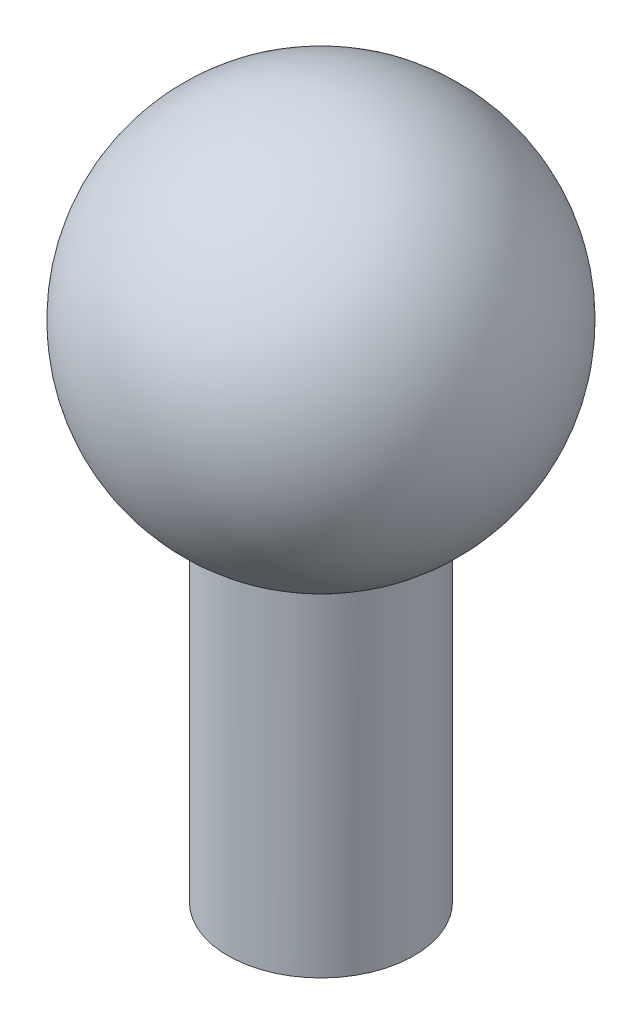
ISO-10303-21;
HEADER;
FILE_DESCRIPTION(('STEP AP214'),'2;1');
FILE_NAME('part.step','',(''),(''),'','','');
FILE_SCHEMA(('AUTOMOTIVE_DESIGN { 1 0 10303 214 1 1 1 1 }'));
ENDSEC;
DATA;
#1=APPLICATION_CONTEXT('core data for automotive mechanical design processes');
#2=APPLICATION_PROTOCOL_DEFINITION('international standard','automotive_design',2000,#1);
#3=PRODUCT_CONTEXT('',#1,'mechanical');
#4=PRODUCT('Part','Part','',(#3));
#5=PRODUCT_RELATED_PRODUCT_CATEGORY('part','',(#4));
#6=PRODUCT_DEFINITION_FORMATION('','',#4);
#7=PRODUCT_DEFINITION_CONTEXT('part definition',#1,'design');
#8=PRODUCT_DEFINITION('design','',#6,#7);
#9=PRODUCT_DEFINITION_SHAPE('','',#8);
#10=(LENGTH_UNIT() NAMED_UNIT(*) SI_UNIT(.MILLI.,.METRE.));
#11=(NAMED_UNIT(*) PLANE_ANGLE_UNIT() SI_UNIT($,.RADIAN.));
#12=(NAMED_UNIT(*) SI_UNIT($,.STERADIAN.) SOLID_ANGLE_UNIT());
#13=UNCERTAINTY_MEASURE_WITH_UNIT(LENGTH_MEASURE(1.E-05),#10,'distance_accuracy_value','');
#14=(GEOMETRIC_REPRESENTATION_CONTEXT(3) GLOBAL_UNCERTAINTY_ASSIGNED_CONTEXT((#13)) GLOBAL_UNIT_ASSIGNED_CONTEXT((#10,
#11,#12)) REPRESENTATION_CONTEXT('',''));
#15=CARTESIAN_POINT('',(0.,0.,0.));
#16=DIRECTION('',(0.,0.,1.));
#17=DIRECTION('',(1.,0.,0.));
#18=AXIS2_PLACEMENT_3D('',#15,#16,#17);
#19=CARTESIAN_POINT('',(0.,65.,0.));
#20=DIRECTION('',(0.,-1.,0.));
#21=DIRECTION('',(1.,0.,0.));
#22=AXIS2_PLACEMENT_3D('',#19,#20,#21);
#23=SPHERICAL_SURFACE('',#22,25.);
#24=CARTESIAN_POINT('',(0.,43.0682878005387,0.));
#25=DIRECTION('',(0.,-1.,0.));
#26=DIRECTION('',(0.,0.,-1.));
#27=AXIS2_PLACEMENT_3D('',#24,#25,#26);
#28=CIRCLE('',#27,12.);
#29=CARTESIAN_POINT('',(0.,43.0682878005387,-12.));
#30=VERTEX_POINT('',#29);
#31=EDGE_CURVE('E10',#30,#30,#28,.T.);
#32=ORIENTED_EDGE('',*,*,#31,.F.);
#33=EDGE_LOOP('',(#32));
#34=FACE_BOUND('',#33,.T.);
#35=ADVANCED_FACE('F45',(#34),#23,.T.);
#36=CARTESIAN_POINT('',(0.,0.,0.));
#37=DIRECTION('',(0.,-1.,0.));
#38=DIRECTION('',(0.,0.,-1.));
#39=AXIS2_PLACEMENT_3D('',#36,#37,#38);
#40=CYLINDRICAL_SURFACE('',#39,12.);
#41=CARTESIAN_POINT('',(0.,0.,0.));
#42=DIRECTION('',(0.,-1.,0.));
#43=DIRECTION('',(0.,0.,-1.));
#44=AXIS2_PLACEMENT_3D('',#41,#42,#43);
#45=CIRCLE('',#44,12.);
#46=CARTESIAN_POINT('',(0.,0.,-12.));
#47=VERTEX_POINT('',#46);
#48=EDGE_CURVE('E52',#47,#47,#45,.T.);
#49=ORIENTED_EDGE('',*,*,#48,.F.);
#50=EDGE_LOOP('',(#49));
#51=FACE_BOUND('',#50,.T.);
#52=ORIENTED_EDGE('',*,*,#31,.T.);
#53=EDGE_LOOP('',(#52));
#54=FACE_BOUND('',#53,.T.);
#55=ADVANCED_FACE('F73',(#51,#54),#40,.T.);
#56=CARTESIAN_POINT('',(0.,0.,0.));
#57=DIRECTION('',(0.,1.,0.));
#58=DIRECTION('',(0.,0.,1.));
#59=AXIS2_PLACEMENT_3D('',#56,#57,#58);
#60=PLANE('',#59);
#61=CARTESIAN_POINT('',(0.,0.,0.));
#62=DIRECTION('',(0.,-1.,0.));
#63=DIRECTION('',(0.,0.,-1.));
#64=AXIS2_PLACEMENT_3D('',#61,#62,#63);
#65=CIRCLE('',#64,10.);
#66=CARTESIAN_POINT('',(0.,0.,-10.));
#67=VERTEX_POINT('',#66);
#68=EDGE_CURVE('E62',#67,#67,#65,.T.);
#69=ORIENTED_EDGE('',*,*,#68,.F.);
#70=EDGE_LOOP('',(#69));
#71=FACE_BOUND('',#70,.T.);
#72=ORIENTED_EDGE('',*,*,#48,.T.);
#73=EDGE_LOOP('',(#72));
#74=FACE_BOUND('',#73,.T.);
#75=ADVANCED_FACE('F71',(#71,#74),#60,.F.);
#76=CARTESIAN_POINT('',(0.,30.,0.));
#77=DIRECTION('',(0.,-1.,0.));
#78=DIRECTION('',(0.,0.,-1.));
#79=AXIS2_PLACEMENT_3D('',#76,#77,#78);
#80=CYLINDRICAL_SURFACE('',#79,10.);
#81=CARTESIAN_POINT('',(0.,30.,0.));
#82=DIRECTION('',(0.,-1.,0.));
#83=DIRECTION('',(0.,0.,-1.));
#84=AXIS2_PLACEMENT_3D('',#81,#82,#83);
#85=CIRCLE('',#84,10.);
#86=CARTESIAN_POINT('',(0.,30.,-10.));
#87=VERTEX_POINT('',#86);
#88=EDGE_CURVE('E57',#87,#87,#85,.T.);
#89=ORIENTED_EDGE('',*,*,#88,.F.);
#90=EDGE_LOOP('',(#89));
#91=FACE_BOUND('',#90,.T.);
#92=ORIENTED_EDGE('',*,*,#68,.T.);
#93=EDGE_LOOP('',(#92));
#94=FACE_BOUND('',#93,.T.);
#95=ADVANCED_FACE('F69',(#91,#94),#80,.F.);
#96=CARTESIAN_POINT('',(0.,30.,0.));
#97=DIRECTION('',(0.,-1.,0.));
#98=DIRECTION('',(0.,0.,-1.));
#99=AXIS2_PLACEMENT_3D('',#96,#97,#98);
#100=PLANE('',#99);
#101=ORIENTED_EDGE('',*,*,#88,.T.);
#102=EDGE_LOOP('',(#101));
#103=FACE_BOUND('',#102,.T.);
#104=ADVANCED_FACE('F79',(#103),#100,.T.);
#105=CLOSED_SHELL('',(#35,#55,#75,#95,#104));
#106=MANIFOLD_SOLID_BREP('B2',#105);
#107=ADVANCED_BREP_SHAPE_REPRESENTATION('',(#18,#106),#14);
#108=SHAPE_DEFINITION_REPRESENTATION(#9,#107);
ENDSEC;
END-ISO-10303-21;
